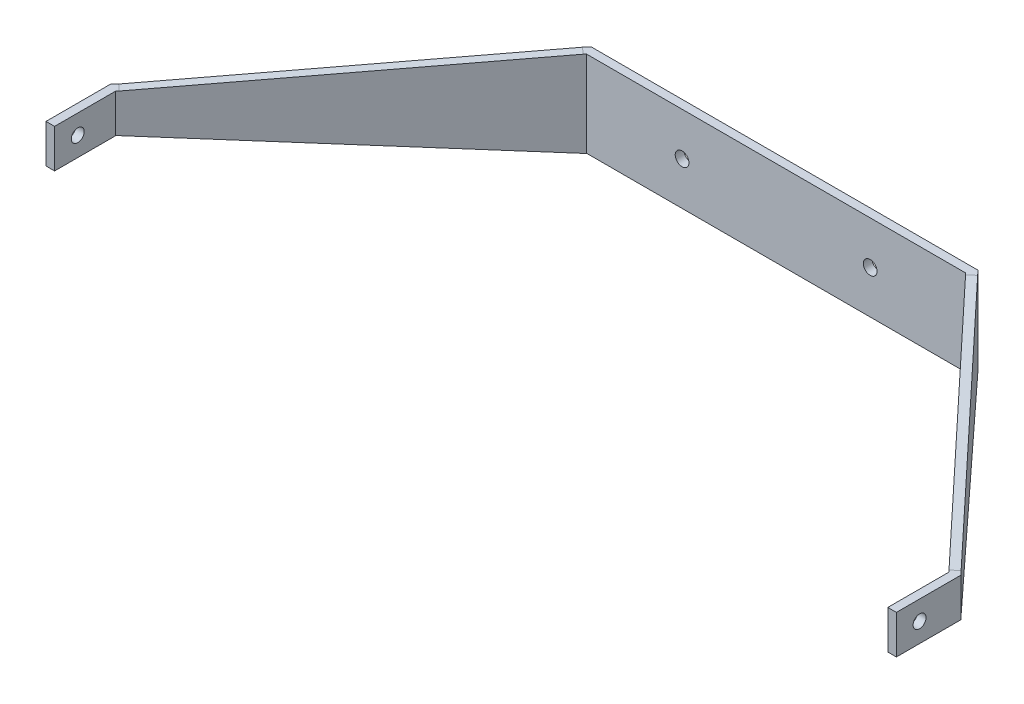
ISO-10303-21;
HEADER;
FILE_DESCRIPTION(('STEP AP214'),'2;1');
FILE_NAME('part.step','',(''),(''),'','','');
FILE_SCHEMA(('AUTOMOTIVE_DESIGN { 1 0 10303 214 1 1 1 1 }'));
ENDSEC;
DATA;
#1=APPLICATION_CONTEXT('core data for automotive mechanical design processes');
#2=APPLICATION_PROTOCOL_DEFINITION('international standard','automotive_design',2000,#1);
#3=PRODUCT_CONTEXT('',#1,'mechanical');
#4=PRODUCT('Part','Part','',(#3));
#5=PRODUCT_RELATED_PRODUCT_CATEGORY('part','',(#4));
#6=PRODUCT_DEFINITION_FORMATION('','',#4);
#7=PRODUCT_DEFINITION_CONTEXT('part definition',#1,'design');
#8=PRODUCT_DEFINITION('design','',#6,#7);
#9=PRODUCT_DEFINITION_SHAPE('','',#8);
#10=(LENGTH_UNIT() NAMED_UNIT(*) SI_UNIT(.MILLI.,.METRE.));
#11=(NAMED_UNIT(*) PLANE_ANGLE_UNIT() SI_UNIT($,.RADIAN.));
#12=(NAMED_UNIT(*) SI_UNIT($,.STERADIAN.) SOLID_ANGLE_UNIT());
#13=UNCERTAINTY_MEASURE_WITH_UNIT(LENGTH_MEASURE(1.E-05),#10,'distance_accuracy_value','');
#14=(GEOMETRIC_REPRESENTATION_CONTEXT(3) GLOBAL_UNCERTAINTY_ASSIGNED_CONTEXT((#13)) GLOBAL_UNIT_ASSIGNED_CONTEXT((#10,
#11,#12)) REPRESENTATION_CONTEXT('',''));
#15=CARTESIAN_POINT('',(0.,0.,0.));
#16=DIRECTION('',(0.,0.,1.));
#17=DIRECTION('',(1.,0.,0.));
#18=AXIS2_PLACEMENT_3D('',#15,#16,#17);
#19=CARTESIAN_POINT('',(122.327482216379,0.,-70.4537234537165));
#20=DIRECTION('',(-0.73189397443135,0.,-0.681418527918843));
#21=DIRECTION('',(0.681418527918843,0.,-0.73189397443135));
#22=AXIS2_PLACEMENT_3D('',#19,#20,#21);
#23=PLANE('',#22);
#24=DIRECTION('',(0.,1.,0.));
#25=VECTOR('',#24,1.);
#26=CARTESIAN_POINT('',(2.,0.,58.786905593505));
#27=LINE('',#26,#25);
#28=CARTESIAN_POINT('',(1.99999999999997,0.,58.786905593505));
#29=VERTEX_POINT('',#28);
#30=CARTESIAN_POINT('',(1.99999999999997,9.,58.786905593505));
#31=VERTEX_POINT('',#30);
#32=EDGE_CURVE('E11',#29,#31,#27,.T.);
#33=ORIENTED_EDGE('',*,*,#32,.F.);
#34=DIRECTION('',(-0.681418527918843,0.,0.73189397443135));
#35=VECTOR('',#34,1.);
#36=CARTESIAN_POINT('',(122.327482216379,0.,-70.4537234537165));
#37=LINE('',#36,#35);
#38=CARTESIAN_POINT('',(2.39245036924484,0.,58.3653848265383));
#39=VERTEX_POINT('',#38);
#40=EDGE_CURVE('E243',#39,#29,#37,.T.);
#41=ORIENTED_EDGE('',*,*,#40,.F.);
#42=DIRECTION('',(-0.679660547415521,0.0717851757294024,0.730005773150003));
#43=VECTOR('',#42,1.);
#44=CARTESIAN_POINT('',(121.709443629971,-12.6021605363077,-69.7899042312789));
#45=LINE('',#44,#43);
#46=CARTESIAN_POINT('',(54.4663357195633,-5.5,2.43417463545552));
#47=VERTEX_POINT('',#46);
#48=EDGE_CURVE('E239',#47,#39,#45,.T.);
#49=ORIENTED_EDGE('',*,*,#48,.F.);
#50=DIRECTION('',(0.681418527918843,0.,-0.73189397443135));
#51=VECTOR('',#50,1.);
#52=CARTESIAN_POINT('',(122.327482216379,-5.5,-70.4537234537165));
#53=LINE('',#52,#51);
#54=CARTESIAN_POINT('',(54.8705672767116,-5.5,2.));
#55=VERTEX_POINT('',#54);
#56=EDGE_CURVE('E235',#47,#55,#53,.T.);
#57=ORIENTED_EDGE('',*,*,#56,.T.);
#58=DIRECTION('',(0.,-1.,0.));
#59=VECTOR('',#58,1.);
#60=CARTESIAN_POINT('',(54.8705672767116,0.,2.));
#61=LINE('',#60,#59);
#62=CARTESIAN_POINT('',(54.8705672767116,14.5,2.));
#63=VERTEX_POINT('',#62);
#64=EDGE_CURVE('E59',#63,#55,#61,.T.);
#65=ORIENTED_EDGE('',*,*,#64,.F.);
#66=DIRECTION('',(0.681418527918843,0.,-0.73189397443135));
#67=VECTOR('',#66,1.);
#68=CARTESIAN_POINT('',(122.327482216379,14.5,-70.4537234537165));
#69=LINE('',#68,#67);
#70=CARTESIAN_POINT('',(54.4663357195633,14.5,2.43417463545552));
#71=VERTEX_POINT('',#70);
#72=EDGE_CURVE('E231',#71,#63,#69,.T.);
#73=ORIENTED_EDGE('',*,*,#72,.F.);
#74=DIRECTION('',(0.679660547415521,0.0717851757294023,-0.730005773150003));
#75=VECTOR('',#74,1.);
#76=CARTESIAN_POINT('',(121.270337663478,21.5557825332172,-69.3182718968974));
#77=LINE('',#76,#75);
#78=CARTESIAN_POINT('',(2.39245036924484,9.,58.3653848265383));
#79=VERTEX_POINT('',#78);
#80=EDGE_CURVE('E226',#79,#71,#77,.T.);
#81=ORIENTED_EDGE('',*,*,#80,.F.);
#82=DIRECTION('',(0.681418527918843,0.,-0.73189397443135));
#83=VECTOR('',#82,1.);
#84=CARTESIAN_POINT('',(122.327482216379,9.,-70.4537234537165));
#85=LINE('',#84,#83);
#86=EDGE_CURVE('E69',#31,#79,#85,.T.);
#87=ORIENTED_EDGE('',*,*,#86,.F.);
#88=EDGE_LOOP('',(#33,#41,#49,#57,#65,#73,#81,#87));
#89=FACE_BOUND('',#88,.T.);
#90=ADVANCED_FACE('F50',(#89),#23,.F.);
#91=CARTESIAN_POINT('',(0.,0.,2.));
#92=DIRECTION('',(0.,0.,1.));
#93=DIRECTION('',(1.,0.,0.));
#94=AXIS2_PLACEMENT_3D('',#91,#92,#93);
#95=PLANE('',#94);
#96=CARTESIAN_POINT('',(120.9,4.5,2.));
#97=DIRECTION('',(0.,0.,1.));
#98=DIRECTION('',(1.,0.,0.));
#99=AXIS2_PLACEMENT_3D('',#96,#97,#98);
#100=CIRCLE('',#99,1.59999999999999);
#101=CARTESIAN_POINT('',(122.5,4.5,2.));
#102=VERTEX_POINT('',#101);
#103=EDGE_CURVE('E712',#102,#102,#100,.T.);
#104=ORIENTED_EDGE('',*,*,#103,.F.);
#105=EDGE_LOOP('',(#104));
#106=FACE_BOUND('',#105,.T.);
#107=CARTESIAN_POINT('',(77.1,4.5,2.));
#108=DIRECTION('',(0.,0.,1.));
#109=DIRECTION('',(1.,0.,0.));
#110=AXIS2_PLACEMENT_3D('',#107,#108,#109);
#111=CIRCLE('',#110,1.60000000000001);
#112=CARTESIAN_POINT('',(78.7,4.5,2.));
#113=VERTEX_POINT('',#112);
#114=EDGE_CURVE('E717',#113,#113,#111,.T.);
#115=ORIENTED_EDGE('',*,*,#114,.F.);
#116=EDGE_LOOP('',(#115));
#117=FACE_BOUND('',#116,.T.);
#118=DIRECTION('',(-1.,0.,0.));
#119=VECTOR('',#118,1.);
#120=CARTESIAN_POINT('',(54.,14.5,2.));
#121=LINE('',#120,#119);
#122=CARTESIAN_POINT('',(143.129432723288,14.5,2.));
#123=VERTEX_POINT('',#122);
#124=EDGE_CURVE('E276',#123,#63,#121,.T.);
#125=ORIENTED_EDGE('',*,*,#124,.T.);
#126=ORIENTED_EDGE('',*,*,#64,.T.);
#127=DIRECTION('',(1.,0.,0.));
#128=VECTOR('',#127,1.);
#129=CARTESIAN_POINT('',(54.,-5.5,2.));
#130=LINE('',#129,#128);
#131=CARTESIAN_POINT('',(143.129432723288,-5.5,2.));
#132=VERTEX_POINT('',#131);
#133=EDGE_CURVE('E279',#55,#132,#130,.T.);
#134=ORIENTED_EDGE('',*,*,#133,.T.);
#135=DIRECTION('',(0.,-1.,0.));
#136=VECTOR('',#135,1.);
#137=CARTESIAN_POINT('',(143.129432723288,0.,2.));
#138=LINE('',#137,#136);
#139=EDGE_CURVE('E394',#123,#132,#138,.T.);
#140=ORIENTED_EDGE('',*,*,#139,.F.);
#141=EDGE_LOOP('',(#125,#126,#134,#140));
#142=FACE_BOUND('',#141,.T.);
#143=ADVANCED_FACE('F404',(#106,#117,#142),#95,.T.);
#144=CARTESIAN_POINT('',(196.,9.,0.));
#145=DIRECTION('',(-1.,0.,0.));
#146=DIRECTION('',(0.,0.,1.));
#147=AXIS2_PLACEMENT_3D('',#144,#145,#146);
#148=PLANE('',#147);
#149=CARTESIAN_POINT('',(196.,4.5,67.6013056648528));
#150=DIRECTION('',(-1.,0.,0.));
#151=DIRECTION('',(0.,0.,1.));
#152=AXIS2_PLACEMENT_3D('',#149,#150,#151);
#153=CIRCLE('',#152,1.5);
#154=CARTESIAN_POINT('',(196.,4.5,69.1013056648528));
#155=VERTEX_POINT('',#154);
#156=EDGE_CURVE('E359',#155,#155,#153,.T.);
#157=ORIENTED_EDGE('',*,*,#156,.F.);
#158=EDGE_LOOP('',(#157));
#159=FACE_BOUND('',#158,.T.);
#160=DIRECTION('',(0.,0.,-1.));
#161=VECTOR('',#160,1.);
#162=CARTESIAN_POINT('',(196.,9.,0.));
#163=LINE('',#162,#161);
#164=CARTESIAN_POINT('',(196.,9.,72.9999999999999));
#165=VERTEX_POINT('',#164);
#166=CARTESIAN_POINT('',(196.,9.,58.786905593505));
#167=VERTEX_POINT('',#166);
#168=EDGE_CURVE('E369',#165,#167,#163,.T.);
#169=ORIENTED_EDGE('',*,*,#168,.T.);
#170=DIRECTION('',(0.,-1.,0.));
#171=VECTOR('',#170,1.);
#172=CARTESIAN_POINT('',(196.,9.,58.786905593505));
#173=LINE('',#172,#171);
#174=CARTESIAN_POINT('',(196.,0.,58.786905593505));
#175=VERTEX_POINT('',#174);
#176=EDGE_CURVE('E343',#167,#175,#173,.T.);
#177=ORIENTED_EDGE('',*,*,#176,.T.);
#178=DIRECTION('',(0.,0.,-1.));
#179=VECTOR('',#178,1.);
#180=CARTESIAN_POINT('',(196.,0.,0.));
#181=LINE('',#180,#179);
#182=CARTESIAN_POINT('',(196.,0.,72.9999999999999));
#183=VERTEX_POINT('',#182);
#184=EDGE_CURVE('E365',#183,#175,#181,.T.);
#185=ORIENTED_EDGE('',*,*,#184,.F.);
#186=DIRECTION('',(0.,-1.,0.));
#187=VECTOR('',#186,1.);
#188=CARTESIAN_POINT('',(196.,9.,72.9999999999999));
#189=LINE('',#188,#187);
#190=EDGE_CURVE('E373',#165,#183,#189,.T.);
#191=ORIENTED_EDGE('',*,*,#190,.F.);
#192=EDGE_LOOP('',(#169,#177,#185,#191));
#193=FACE_BOUND('',#192,.T.);
#194=ADVANCED_FACE('F471',(#159,#193),#148,.T.);
#195=CARTESIAN_POINT('',(0.,9.,72.9999999999999));
#196=DIRECTION('',(0.,0.,1.));
#197=DIRECTION('',(1.,0.,0.));
#198=AXIS2_PLACEMENT_3D('',#195,#196,#197);
#199=PLANE('',#198);
#200=DIRECTION('',(-1.,0.,0.));
#201=VECTOR('',#200,1.);
#202=CARTESIAN_POINT('',(0.,0.,72.9999999999999));
#203=LINE('',#202,#201);
#204=CARTESIAN_POINT('',(198.,0.,72.9999999999999));
#205=VERTEX_POINT('',#204);
#206=EDGE_CURVE('E374',#205,#183,#203,.T.);
#207=ORIENTED_EDGE('',*,*,#206,.F.);
#208=DIRECTION('',(0.,-1.,0.));
#209=VECTOR('',#208,1.);
#210=CARTESIAN_POINT('',(198.,9.,72.9999999999999));
#211=LINE('',#210,#209);
#212=CARTESIAN_POINT('',(198.,9.,72.9999999999999));
#213=VERTEX_POINT('',#212);
#214=EDGE_CURVE('E391',#213,#205,#211,.T.);
#215=ORIENTED_EDGE('',*,*,#214,.F.);
#216=DIRECTION('',(-1.,0.,0.));
#217=VECTOR('',#216,1.);
#218=CARTESIAN_POINT('',(0.,9.,72.9999999999999));
#219=LINE('',#218,#217);
#220=EDGE_CURVE('E360',#213,#165,#219,.T.);
#221=ORIENTED_EDGE('',*,*,#220,.T.);
#222=ORIENTED_EDGE('',*,*,#190,.T.);
#223=EDGE_LOOP('',(#207,#215,#221,#222));
#224=FACE_BOUND('',#223,.T.);
#225=ADVANCED_FACE('F52',(#224),#199,.T.);
#226=CARTESIAN_POINT('',(198.,9.,0.));
#227=DIRECTION('',(-1.,0.,0.));
#228=DIRECTION('',(0.,0.,1.));
#229=AXIS2_PLACEMENT_3D('',#226,#227,#228);
#230=PLANE('',#229);
#231=CARTESIAN_POINT('',(198.,4.5,67.6013056648528));
#232=DIRECTION('',(1.,0.,0.));
#233=DIRECTION('',(0.,0.,-1.));
#234=AXIS2_PLACEMENT_3D('',#231,#232,#233);
#235=CIRCLE('',#234,1.5);
#236=CARTESIAN_POINT('',(198.,4.5,66.1013056648528));
#237=VERTEX_POINT('',#236);
#238=EDGE_CURVE('E355',#237,#237,#235,.T.);
#239=ORIENTED_EDGE('',*,*,#238,.F.);
#240=EDGE_LOOP('',(#239));
#241=FACE_BOUND('',#240,.T.);
#242=DIRECTION('',(0.,0.,-1.));
#243=VECTOR('',#242,1.);
#244=CARTESIAN_POINT('',(198.,0.,0.));
#245=LINE('',#244,#243);
#246=CARTESIAN_POINT('',(198.,0.,58.));
#247=VERTEX_POINT('',#246);
#248=EDGE_CURVE('E378',#205,#247,#245,.T.);
#249=ORIENTED_EDGE('',*,*,#248,.T.);
#250=DIRECTION('',(0.,-1.,0.));
#251=VECTOR('',#250,1.);
#252=CARTESIAN_POINT('',(198.,9.,58.));
#253=LINE('',#252,#251);
#254=CARTESIAN_POINT('',(198.,9.,58.));
#255=VERTEX_POINT('',#254);
#256=EDGE_CURVE('E387',#255,#247,#253,.T.);
#257=ORIENTED_EDGE('',*,*,#256,.F.);
#258=DIRECTION('',(0.,0.,-1.));
#259=VECTOR('',#258,1.);
#260=CARTESIAN_POINT('',(198.,9.,0.));
#261=LINE('',#260,#259);
#262=EDGE_CURVE('E364',#213,#255,#261,.T.);
#263=ORIENTED_EDGE('',*,*,#262,.F.);
#264=ORIENTED_EDGE('',*,*,#214,.T.);
#265=EDGE_LOOP('',(#249,#257,#263,#264));
#266=FACE_BOUND('',#265,.T.);
#267=ADVANCED_FACE('F509',(#241,#266),#230,.F.);
#268=CARTESIAN_POINT('',(0.,9.,0.));
#269=DIRECTION('',(0.,1.,0.));
#270=DIRECTION('',(0.,0.,1.));
#271=AXIS2_PLACEMENT_3D('',#268,#269,#270);
#272=PLANE('',#271);
#273=ORIENTED_EDGE('',*,*,#262,.T.);
#274=DIRECTION('',(-0.681418527918843,0.,-0.73189397443135));
#275=VECTOR('',#274,1.);
#276=CARTESIAN_POINT('',(77.136305732484,9.,-71.8165605095542));
#277=LINE('',#276,#275);
#278=CARTESIAN_POINT('',(197.071337579618,9.,57.0025477707006));
#279=VERTEX_POINT('',#278);
#280=EDGE_CURVE('E283',#255,#279,#277,.T.);
#281=ORIENTED_EDGE('',*,*,#280,.T.);
#282=DIRECTION('',(0.731893974431349,0.,-0.681418527918843));
#283=VECTOR('',#282,1.);
#284=CARTESIAN_POINT('',(195.607549630755,9.,58.3653848265383));
#285=LINE('',#284,#283);
#286=CARTESIAN_POINT('',(195.607549630755,9.,58.3653848265383));
#287=VERTEX_POINT('',#286);
#288=EDGE_CURVE('E340',#287,#279,#285,.T.);
#289=ORIENTED_EDGE('',*,*,#288,.F.);
#290=DIRECTION('',(-0.681418527918843,0.,-0.73189397443135));
#291=VECTOR('',#290,1.);
#292=CARTESIAN_POINT('',(75.6725177836213,9.,-70.4537234537165));
#293=LINE('',#292,#291);
#294=EDGE_CURVE('E292',#167,#287,#293,.T.);
#295=ORIENTED_EDGE('',*,*,#294,.F.);
#296=ORIENTED_EDGE('',*,*,#168,.F.);
#297=ORIENTED_EDGE('',*,*,#220,.F.);
#298=EDGE_LOOP('',(#273,#281,#289,#295,#296,#297));
#299=FACE_BOUND('',#298,.T.);
#300=ADVANCED_FACE('F506',(#299),#272,.T.);
#301=CARTESIAN_POINT('',(0.,0.,0.));
#302=DIRECTION('',(0.,1.,0.));
#303=DIRECTION('',(0.,0.,1.));
#304=AXIS2_PLACEMENT_3D('',#301,#302,#303);
#305=PLANE('',#304);
#306=DIRECTION('',(0.681418527918843,0.,0.73189397443135));
#307=VECTOR('',#306,1.);
#308=CARTESIAN_POINT('',(75.6725177836213,0.,-70.4537234537165));
#309=LINE('',#308,#307);
#310=CARTESIAN_POINT('',(195.607549630755,0.,58.3653848265383));
#311=VERTEX_POINT('',#310);
#312=EDGE_CURVE('E295',#311,#175,#309,.T.);
#313=ORIENTED_EDGE('',*,*,#312,.F.);
#314=DIRECTION('',(0.731893974431349,0.,-0.681418527918843));
#315=VECTOR('',#314,1.);
#316=CARTESIAN_POINT('',(195.607549630755,0.,58.3653848265383));
#317=LINE('',#316,#315);
#318=CARTESIAN_POINT('',(197.071337579618,0.,57.0025477707006));
#319=VERTEX_POINT('',#318);
#320=EDGE_CURVE('E314',#311,#319,#317,.T.);
#321=ORIENTED_EDGE('',*,*,#320,.T.);
#322=DIRECTION('',(0.681418527918843,0.,0.73189397443135));
#323=VECTOR('',#322,1.);
#324=CARTESIAN_POINT('',(77.136305732484,0.,-71.8165605095542));
#325=LINE('',#324,#323);
#326=EDGE_CURVE('E318',#319,#247,#325,.T.);
#327=ORIENTED_EDGE('',*,*,#326,.T.);
#328=ORIENTED_EDGE('',*,*,#248,.F.);
#329=ORIENTED_EDGE('',*,*,#206,.T.);
#330=ORIENTED_EDGE('',*,*,#184,.T.);
#331=EDGE_LOOP('',(#313,#321,#327,#328,#329,#330));
#332=FACE_BOUND('',#331,.T.);
#333=ADVANCED_FACE('F504',(#332),#305,.F.);
#334=CARTESIAN_POINT('',(0.,4.5,67.6013056648528));
#335=DIRECTION('',(1.,0.,0.));
#336=DIRECTION('',(0.,0.,-1.));
#337=AXIS2_PLACEMENT_3D('',#334,#335,#336);
#338=CYLINDRICAL_SURFACE('',#337,1.5);
#339=ORIENTED_EDGE('',*,*,#156,.T.);
#340=EDGE_LOOP('',(#339));
#341=FACE_BOUND('',#340,.T.);
#342=ORIENTED_EDGE('',*,*,#238,.T.);
#343=EDGE_LOOP('',(#342));
#344=FACE_BOUND('',#343,.T.);
#345=ADVANCED_FACE('F494',(#341,#344),#338,.F.);
#346=CARTESIAN_POINT('',(76.7296623365218,21.5557825332172,-69.3182718968974));
#347=DIRECTION('',(-0.0489157487719248,-0.997420116372985,-0.0525391375698451));
#348=DIRECTION('',(0.,0.0526021071184824,-0.998615550813573));
#349=AXIS2_PLACEMENT_3D('',#346,#347,#348);
#350=PLANE('',#349);
#351=DIRECTION('',(-0.679660547415521,0.0717851757294023,-0.730005773150003));
#352=VECTOR('',#351,1.);
#353=CARTESIAN_POINT('',(78.1934502853845,21.5557825332172,-70.6811089527351));
#354=LINE('',#353,#352);
#355=CARTESIAN_POINT('',(144.997452229299,14.5,1.07133757961783));
#356=VERTEX_POINT('',#355);
#357=EDGE_CURVE('E296',#279,#356,#354,.T.);
#358=ORIENTED_EDGE('',*,*,#357,.T.);
#359=DIRECTION('',(0.731893974431349,0.,-0.681418527918843));
#360=VECTOR('',#359,1.);
#361=CARTESIAN_POINT('',(143.533664280437,14.5,2.43417463545552));
#362=LINE('',#361,#360);
#363=CARTESIAN_POINT('',(143.533664280437,14.5,2.43417463545552));
#364=VERTEX_POINT('',#363);
#365=EDGE_CURVE('E344',#364,#356,#362,.T.);
#366=ORIENTED_EDGE('',*,*,#365,.F.);
#367=DIRECTION('',(-0.679660547415521,0.0717851757294023,-0.730005773150003));
#368=VECTOR('',#367,1.);
#369=CARTESIAN_POINT('',(76.7296623365218,21.5557825332172,-69.3182718968974));
#370=LINE('',#369,#368);
#371=EDGE_CURVE('E311',#287,#364,#370,.T.);
#372=ORIENTED_EDGE('',*,*,#371,.F.);
#373=ORIENTED_EDGE('',*,*,#288,.T.);
#374=EDGE_LOOP('',(#358,#366,#372,#373));
#375=FACE_BOUND('',#374,.T.);
#376=ADVANCED_FACE('F491',(#375),#350,.F.);
#377=CARTESIAN_POINT('',(75.6725177836213,14.5,-70.4537234537165));
#378=DIRECTION('',(0.,-1.,0.));
#379=DIRECTION('',(0.,0.,-1.));
#380=AXIS2_PLACEMENT_3D('',#377,#378,#379);
#381=PLANE('',#380);
#382=DIRECTION('',(-1.,0.,0.));
#383=VECTOR('',#382,1.);
#384=CARTESIAN_POINT('',(54.,14.5,0.));
#385=LINE('',#384,#383);
#386=CARTESIAN_POINT('',(144.,14.5,0.));
#387=VERTEX_POINT('',#386);
#388=CARTESIAN_POINT('',(54.,14.5,0.));
#389=VERTEX_POINT('',#388);
#390=EDGE_CURVE('E267',#387,#389,#385,.T.);
#391=ORIENTED_EDGE('',*,*,#390,.T.);
#392=DIRECTION('',(0.681418527918843,0.,-0.73189397443135));
#393=VECTOR('',#392,1.);
#394=CARTESIAN_POINT('',(120.863694267516,14.5,-71.8165605095542));
#395=LINE('',#394,#393);
#396=CARTESIAN_POINT('',(53.0025477707006,14.5,1.07133757961783));
#397=VERTEX_POINT('',#396);
#398=EDGE_CURVE('E250',#397,#389,#395,.T.);
#399=ORIENTED_EDGE('',*,*,#398,.F.);
#400=DIRECTION('',(-0.731893974431349,0.,-0.681418527918843));
#401=VECTOR('',#400,1.);
#402=CARTESIAN_POINT('',(54.4663357195633,14.5,2.43417463545552));
#403=LINE('',#402,#401);
#404=EDGE_CURVE('E271',#71,#397,#403,.T.);
#405=ORIENTED_EDGE('',*,*,#404,.F.);
#406=ORIENTED_EDGE('',*,*,#72,.T.);
#407=ORIENTED_EDGE('',*,*,#124,.F.);
#408=DIRECTION('',(-0.681418527918843,0.,-0.73189397443135));
#409=VECTOR('',#408,1.);
#410=CARTESIAN_POINT('',(75.6725177836213,14.5,-70.4537234537165));
#411=LINE('',#410,#409);
#412=EDGE_CURVE('E307',#364,#123,#411,.T.);
#413=ORIENTED_EDGE('',*,*,#412,.F.);
#414=ORIENTED_EDGE('',*,*,#365,.T.);
#415=DIRECTION('',(-0.681418527918843,0.,-0.73189397443135));
#416=VECTOR('',#415,1.);
#417=CARTESIAN_POINT('',(77.136305732484,14.5,-71.8165605095542));
#418=LINE('',#417,#416);
#419=EDGE_CURVE('E333',#356,#387,#418,.T.);
#420=ORIENTED_EDGE('',*,*,#419,.T.);
#421=EDGE_LOOP('',(#391,#399,#405,#406,#407,#413,#414,#420));
#422=FACE_BOUND('',#421,.T.);
#423=ADVANCED_FACE('F438',(#422),#381,.F.);
#424=CARTESIAN_POINT('',(75.6725177836213,-5.5,-70.4537234537165));
#425=DIRECTION('',(0.,-1.,0.));
#426=DIRECTION('',(0.,0.,-1.));
#427=AXIS2_PLACEMENT_3D('',#424,#425,#426);
#428=PLANE('',#427);
#429=DIRECTION('',(0.681418527918843,0.,-0.73189397443135));
#430=VECTOR('',#429,1.);
#431=CARTESIAN_POINT('',(120.863694267516,-5.5,-71.8165605095542));
#432=LINE('',#431,#430);
#433=CARTESIAN_POINT('',(53.0025477707006,-5.5,1.07133757961783));
#434=VERTEX_POINT('',#433);
#435=CARTESIAN_POINT('',(54.,-5.5,0.));
#436=VERTEX_POINT('',#435);
#437=EDGE_CURVE('E254',#434,#436,#432,.T.);
#438=ORIENTED_EDGE('',*,*,#437,.T.);
#439=DIRECTION('',(1.,0.,0.));
#440=VECTOR('',#439,1.);
#441=CARTESIAN_POINT('',(54.,-5.5,0.));
#442=LINE('',#441,#440);
#443=CARTESIAN_POINT('',(144.,-5.5,0.));
#444=VERTEX_POINT('',#443);
#445=EDGE_CURVE('E280',#436,#444,#442,.T.);
#446=ORIENTED_EDGE('',*,*,#445,.T.);
#447=DIRECTION('',(-0.681418527918843,0.,-0.73189397443135));
#448=VECTOR('',#447,1.);
#449=CARTESIAN_POINT('',(77.136305732484,-5.5,-71.8165605095542));
#450=LINE('',#449,#448);
#451=CARTESIAN_POINT('',(144.997452229299,-5.5,1.07133757961783));
#452=VERTEX_POINT('',#451);
#453=EDGE_CURVE('E325',#452,#444,#450,.T.);
#454=ORIENTED_EDGE('',*,*,#453,.F.);
#455=DIRECTION('',(0.731893974431349,0.,-0.681418527918843));
#456=VECTOR('',#455,1.);
#457=CARTESIAN_POINT('',(143.533664280437,-5.5,2.43417463545552));
#458=LINE('',#457,#456);
#459=CARTESIAN_POINT('',(143.533664280437,-5.5,2.43417463545552));
#460=VERTEX_POINT('',#459);
#461=EDGE_CURVE('E347',#460,#452,#458,.T.);
#462=ORIENTED_EDGE('',*,*,#461,.F.);
#463=DIRECTION('',(-0.681418527918843,0.,-0.73189397443135));
#464=VECTOR('',#463,1.);
#465=CARTESIAN_POINT('',(75.6725177836213,-5.5,-70.4537234537165));
#466=LINE('',#465,#464);
#467=EDGE_CURVE('E303',#460,#132,#466,.T.);
#468=ORIENTED_EDGE('',*,*,#467,.T.);
#469=ORIENTED_EDGE('',*,*,#133,.F.);
#470=ORIENTED_EDGE('',*,*,#56,.F.);
#471=DIRECTION('',(-0.731893974431349,0.,-0.681418527918843));
#472=VECTOR('',#471,1.);
#473=CARTESIAN_POINT('',(54.4663357195633,-5.5,2.43417463545552));
#474=LINE('',#473,#472);
#475=EDGE_CURVE('E268',#47,#434,#474,.T.);
#476=ORIENTED_EDGE('',*,*,#475,.T.);
#477=EDGE_LOOP('',(#438,#446,#454,#462,#468,#469,#470,#476));
#478=FACE_BOUND('',#477,.T.);
#479=ADVANCED_FACE('F409',(#478),#428,.T.);
#480=CARTESIAN_POINT('',(76.2905563700287,-12.6021605363077,-69.7899042312789));
#481=DIRECTION('',(-0.0489157487719248,0.997420116372985,-0.0525391375698451));
#482=DIRECTION('',(0.,0.0526021071184824,0.998615550813573));
#483=AXIS2_PLACEMENT_3D('',#480,#481,#482);
#484=PLANE('',#483);
#485=DIRECTION('',(0.679660547415521,0.0717851757294024,0.730005773150003));
#486=VECTOR('',#485,1.);
#487=CARTESIAN_POINT('',(77.7543443188914,-12.6021605363077,-71.1527412871165));
#488=LINE('',#487,#486);
#489=EDGE_CURVE('E321',#452,#319,#488,.T.);
#490=ORIENTED_EDGE('',*,*,#489,.T.);
#491=ORIENTED_EDGE('',*,*,#320,.F.);
#492=DIRECTION('',(0.679660547415521,0.0717851757294024,0.730005773150003));
#493=VECTOR('',#492,1.);
#494=CARTESIAN_POINT('',(76.2905563700287,-12.6021605363077,-69.7899042312789));
#495=LINE('',#494,#493);
#496=EDGE_CURVE('E299',#460,#311,#495,.T.);
#497=ORIENTED_EDGE('',*,*,#496,.F.);
#498=ORIENTED_EDGE('',*,*,#461,.T.);
#499=EDGE_LOOP('',(#490,#491,#497,#498));
#500=FACE_BOUND('',#499,.T.);
#501=ADVANCED_FACE('F432',(#500),#484,.F.);
#502=CARTESIAN_POINT('',(75.6725177836213,0.,-70.4537234537165));
#503=DIRECTION('',(0.73189397443135,0.,-0.681418527918843));
#504=DIRECTION('',(-0.681418527918843,0.,-0.73189397443135));
#505=AXIS2_PLACEMENT_3D('',#502,#503,#504);
#506=PLANE('',#505);
#507=ORIENTED_EDGE('',*,*,#412,.T.);
#508=ORIENTED_EDGE('',*,*,#139,.T.);
#509=ORIENTED_EDGE('',*,*,#467,.F.);
#510=ORIENTED_EDGE('',*,*,#496,.T.);
#511=ORIENTED_EDGE('',*,*,#312,.T.);
#512=ORIENTED_EDGE('',*,*,#176,.F.);
#513=ORIENTED_EDGE('',*,*,#294,.T.);
#514=ORIENTED_EDGE('',*,*,#371,.T.);
#515=EDGE_LOOP('',(#507,#508,#509,#510,#511,#512,#513,#514));
#516=FACE_BOUND('',#515,.T.);
#517=ADVANCED_FACE('F435',(#516),#506,.F.);
#518=CARTESIAN_POINT('',(77.136305732484,0.,-71.8165605095542));
#519=DIRECTION('',(0.73189397443135,0.,-0.681418527918843));
#520=DIRECTION('',(-0.681418527918843,0.,-0.73189397443135));
#521=AXIS2_PLACEMENT_3D('',#518,#519,#520);
#522=PLANE('',#521);
#523=ORIENTED_EDGE('',*,*,#280,.F.);
#524=ORIENTED_EDGE('',*,*,#256,.T.);
#525=ORIENTED_EDGE('',*,*,#326,.F.);
#526=ORIENTED_EDGE('',*,*,#489,.F.);
#527=ORIENTED_EDGE('',*,*,#453,.T.);
#528=DIRECTION('',(0.,1.,0.));
#529=VECTOR('',#528,1.);
#530=CARTESIAN_POINT('',(144.,0.,0.));
#531=LINE('',#530,#529);
#532=EDGE_CURVE('E329',#444,#387,#531,.T.);
#533=ORIENTED_EDGE('',*,*,#532,.T.);
#534=ORIENTED_EDGE('',*,*,#419,.F.);
#535=ORIENTED_EDGE('',*,*,#357,.F.);
#536=EDGE_LOOP('',(#523,#524,#525,#526,#527,#533,#534,#535));
#537=FACE_BOUND('',#536,.T.);
#538=ADVANCED_FACE('F428',(#537),#522,.T.);
#539=CARTESIAN_POINT('',(0.,0.,0.));
#540=DIRECTION('',(0.,0.,1.));
#541=DIRECTION('',(1.,0.,0.));
#542=AXIS2_PLACEMENT_3D('',#539,#540,#541);
#543=PLANE('',#542);
#544=CARTESIAN_POINT('',(120.9,4.5,0.));
#545=DIRECTION('',(0.,0.,-1.));
#546=DIRECTION('',(-1.,0.,0.));
#547=AXIS2_PLACEMENT_3D('',#544,#545,#546);
#548=CIRCLE('',#547,1.59999999999999);
#549=CARTESIAN_POINT('',(119.3,4.5,0.));
#550=VERTEX_POINT('',#549);
#551=EDGE_CURVE('E715',#550,#550,#548,.T.);
#552=ORIENTED_EDGE('',*,*,#551,.F.);
#553=EDGE_LOOP('',(#552));
#554=FACE_BOUND('',#553,.T.);
#555=CARTESIAN_POINT('',(77.1,4.5,0.));
#556=DIRECTION('',(0.,0.,-1.));
#557=DIRECTION('',(-1.,0.,0.));
#558=AXIS2_PLACEMENT_3D('',#555,#556,#557);
#559=CIRCLE('',#558,1.60000000000001);
#560=CARTESIAN_POINT('',(75.5,4.5,0.));
#561=VERTEX_POINT('',#560);
#562=EDGE_CURVE('E718',#561,#561,#559,.T.);
#563=ORIENTED_EDGE('',*,*,#562,.F.);
#564=EDGE_LOOP('',(#563));
#565=FACE_BOUND('',#564,.T.);
#566=ORIENTED_EDGE('',*,*,#532,.F.);
#567=ORIENTED_EDGE('',*,*,#445,.F.);
#568=DIRECTION('',(0.,-1.,0.));
#569=VECTOR('',#568,1.);
#570=CARTESIAN_POINT('',(54.,14.5,0.));
#571=LINE('',#570,#569);
#572=EDGE_CURVE('E286',#389,#436,#571,.T.);
#573=ORIENTED_EDGE('',*,*,#572,.F.);
#574=ORIENTED_EDGE('',*,*,#390,.F.);
#575=EDGE_LOOP('',(#566,#567,#573,#574));
#576=FACE_BOUND('',#575,.T.);
#577=ADVANCED_FACE('F423',(#554,#565,#576),#543,.F.);
#578=CARTESIAN_POINT('',(122.327482216379,9.,-70.4537234537165));
#579=DIRECTION('',(0.,1.,0.));
#580=DIRECTION('',(0.,0.,1.));
#581=AXIS2_PLACEMENT_3D('',#578,#579,#580);
#582=PLANE('',#581);
#583=DIRECTION('',(0.681418527918843,0.,-0.73189397443135));
#584=VECTOR('',#583,1.);
#585=CARTESIAN_POINT('',(120.863694267516,9.,-71.8165605095542));
#586=LINE('',#585,#584);
#587=CARTESIAN_POINT('',(0.,9.,58.));
#588=VERTEX_POINT('',#587);
#589=CARTESIAN_POINT('',(0.928662420382143,9.,57.0025477707006));
#590=VERTEX_POINT('',#589);
#591=EDGE_CURVE('E211',#588,#590,#586,.T.);
#592=ORIENTED_EDGE('',*,*,#591,.F.);
#593=DIRECTION('',(0.,0.,1.));
#594=VECTOR('',#593,1.);
#595=CARTESIAN_POINT('',(0.,9.,0.));
#596=LINE('',#595,#594);
#597=CARTESIAN_POINT('',(0.,9.,73.));
#598=VERTEX_POINT('',#597);
#599=EDGE_CURVE('E194',#588,#598,#596,.T.);
#600=ORIENTED_EDGE('',*,*,#599,.T.);
#601=DIRECTION('',(1.,0.,0.));
#602=VECTOR('',#601,1.);
#603=CARTESIAN_POINT('',(0.,9.,73.));
#604=LINE('',#603,#602);
#605=CARTESIAN_POINT('',(2.,9.,73.));
#606=VERTEX_POINT('',#605);
#607=EDGE_CURVE('E195',#598,#606,#604,.T.);
#608=ORIENTED_EDGE('',*,*,#607,.T.);
#609=DIRECTION('',(0.,0.,-1.));
#610=VECTOR('',#609,1.);
#611=CARTESIAN_POINT('',(2.,9.,0.));
#612=LINE('',#611,#610);
#613=EDGE_CURVE('E185',#606,#31,#612,.T.);
#614=ORIENTED_EDGE('',*,*,#613,.T.);
#615=ORIENTED_EDGE('',*,*,#86,.T.);
#616=DIRECTION('',(-0.731893974431349,0.,-0.681418527918843));
#617=VECTOR('',#616,1.);
#618=CARTESIAN_POINT('',(2.39245036924484,9.,58.3653848265383));
#619=LINE('',#618,#617);
#620=EDGE_CURVE('E245',#79,#590,#619,.T.);
#621=ORIENTED_EDGE('',*,*,#620,.T.);
#622=EDGE_LOOP('',(#592,#600,#608,#614,#615,#621));
#623=FACE_BOUND('',#622,.T.);
#624=ADVANCED_FACE('F199',(#623),#582,.T.);
#625=CARTESIAN_POINT('',(122.327482216379,0.,-70.4537234537165));
#626=DIRECTION('',(0.,-1.,0.));
#627=DIRECTION('',(0.,0.,-1.));
#628=AXIS2_PLACEMENT_3D('',#625,#626,#627);
#629=PLANE('',#628);
#630=DIRECTION('',(-0.681418527918843,0.,0.73189397443135));
#631=VECTOR('',#630,1.);
#632=CARTESIAN_POINT('',(120.863694267516,0.,-71.8165605095542));
#633=LINE('',#632,#631);
#634=CARTESIAN_POINT('',(0.928662420382143,0.,57.0025477707006));
#635=VERTEX_POINT('',#634);
#636=CARTESIAN_POINT('',(0.,0.,58.));
#637=VERTEX_POINT('',#636);
#638=EDGE_CURVE('E227',#635,#637,#633,.T.);
#639=ORIENTED_EDGE('',*,*,#638,.F.);
#640=DIRECTION('',(-0.731893974431349,0.,-0.681418527918843));
#641=VECTOR('',#640,1.);
#642=CARTESIAN_POINT('',(2.39245036924484,0.,58.3653848265383));
#643=LINE('',#642,#641);
#644=EDGE_CURVE('E264',#39,#635,#643,.T.);
#645=ORIENTED_EDGE('',*,*,#644,.F.);
#646=ORIENTED_EDGE('',*,*,#40,.T.);
#647=DIRECTION('',(0.,0.,-1.));
#648=VECTOR('',#647,1.);
#649=CARTESIAN_POINT('',(2.,0.,0.));
#650=LINE('',#649,#648);
#651=CARTESIAN_POINT('',(2.,0.,73.));
#652=VERTEX_POINT('',#651);
#653=EDGE_CURVE('E452',#652,#29,#650,.T.);
#654=ORIENTED_EDGE('',*,*,#653,.F.);
#655=DIRECTION('',(1.,0.,0.));
#656=VECTOR('',#655,1.);
#657=CARTESIAN_POINT('',(0.,0.,73.));
#658=LINE('',#657,#656);
#659=CARTESIAN_POINT('',(0.,0.,73.));
#660=VERTEX_POINT('',#659);
#661=EDGE_CURVE('E209',#660,#652,#658,.T.);
#662=ORIENTED_EDGE('',*,*,#661,.F.);
#663=DIRECTION('',(0.,0.,1.));
#664=VECTOR('',#663,1.);
#665=CARTESIAN_POINT('',(0.,0.,0.));
#666=LINE('',#665,#664);
#667=EDGE_CURVE('E205',#637,#660,#666,.T.);
#668=ORIENTED_EDGE('',*,*,#667,.F.);
#669=EDGE_LOOP('',(#639,#645,#646,#654,#662,#668));
#670=FACE_BOUND('',#669,.T.);
#671=ADVANCED_FACE('F458',(#670),#629,.T.);
#672=CARTESIAN_POINT('',(121.709443629971,-12.6021605363077,-69.7899042312789));
#673=DIRECTION('',(-0.0489157487719248,-0.997420116372985,0.0525391375698451));
#674=DIRECTION('',(0.,-0.0526021071184824,-0.998615550813573));
#675=AXIS2_PLACEMENT_3D('',#672,#673,#674);
#676=PLANE('',#675);
#677=DIRECTION('',(-0.679660547415521,0.0717851757294024,0.730005773150003));
#678=VECTOR('',#677,1.);
#679=CARTESIAN_POINT('',(120.245655681109,-12.6021605363077,-71.1527412871165));
#680=LINE('',#679,#678);
#681=EDGE_CURVE('E258',#434,#635,#680,.T.);
#682=ORIENTED_EDGE('',*,*,#681,.F.);
#683=ORIENTED_EDGE('',*,*,#475,.F.);
#684=ORIENTED_EDGE('',*,*,#48,.T.);
#685=ORIENTED_EDGE('',*,*,#644,.T.);
#686=EDGE_LOOP('',(#682,#683,#684,#685));
#687=FACE_BOUND('',#686,.T.);
#688=ADVANCED_FACE('F414',(#687),#676,.T.);
#689=CARTESIAN_POINT('',(121.270337663478,21.5557825332172,-69.3182718968974));
#690=DIRECTION('',(-0.0489157487719248,0.997420116372985,0.0525391375698451));
#691=DIRECTION('',(0.,-0.0526021071184824,0.998615550813573));
#692=AXIS2_PLACEMENT_3D('',#689,#690,#691);
#693=PLANE('',#692);
#694=DIRECTION('',(0.679660547415521,0.0717851757294023,-0.730005773150003));
#695=VECTOR('',#694,1.);
#696=CARTESIAN_POINT('',(119.806549714615,21.5557825332172,-70.6811089527351));
#697=LINE('',#696,#695);
#698=EDGE_CURVE('E217',#590,#397,#697,.T.);
#699=ORIENTED_EDGE('',*,*,#698,.F.);
#700=ORIENTED_EDGE('',*,*,#620,.F.);
#701=ORIENTED_EDGE('',*,*,#80,.T.);
#702=ORIENTED_EDGE('',*,*,#404,.T.);
#703=EDGE_LOOP('',(#699,#700,#701,#702));
#704=FACE_BOUND('',#703,.T.);
#705=ADVANCED_FACE('F442',(#704),#693,.T.);
#706=CARTESIAN_POINT('',(120.863694267516,0.,-71.8165605095542));
#707=DIRECTION('',(-0.73189397443135,0.,-0.681418527918843));
#708=DIRECTION('',(0.681418527918843,0.,-0.73189397443135));
#709=AXIS2_PLACEMENT_3D('',#706,#707,#708);
#710=PLANE('',#709);
#711=ORIENTED_EDGE('',*,*,#591,.T.);
#712=ORIENTED_EDGE('',*,*,#698,.T.);
#713=ORIENTED_EDGE('',*,*,#398,.T.);
#714=ORIENTED_EDGE('',*,*,#572,.T.);
#715=ORIENTED_EDGE('',*,*,#437,.F.);
#716=ORIENTED_EDGE('',*,*,#681,.T.);
#717=ORIENTED_EDGE('',*,*,#638,.T.);
#718=DIRECTION('',(0.,-1.,0.));
#719=VECTOR('',#718,1.);
#720=CARTESIAN_POINT('',(0.,9.,58.));
#721=LINE('',#720,#719);
#722=EDGE_CURVE('E212',#588,#637,#721,.T.);
#723=ORIENTED_EDGE('',*,*,#722,.F.);
#724=EDGE_LOOP('',(#711,#712,#713,#714,#715,#716,#717,#723));
#725=FACE_BOUND('',#724,.T.);
#726=ADVANCED_FACE('F418',(#725),#710,.T.);
#727=CARTESIAN_POINT('',(2.,9.,0.));
#728=DIRECTION('',(-1.,0.,0.));
#729=DIRECTION('',(0.,0.,1.));
#730=AXIS2_PLACEMENT_3D('',#727,#728,#729);
#731=PLANE('',#730);
#732=CARTESIAN_POINT('',(2.,4.5,67.6013056648528));
#733=DIRECTION('',(-1.,0.,0.));
#734=DIRECTION('',(0.,0.,1.));
#735=AXIS2_PLACEMENT_3D('',#732,#733,#734);
#736=CIRCLE('',#735,1.5);
#737=CARTESIAN_POINT('',(2.,4.5,69.1013056648528));
#738=VERTEX_POINT('',#737);
#739=EDGE_CURVE('E453',#738,#738,#736,.T.);
#740=ORIENTED_EDGE('',*,*,#739,.T.);
#741=EDGE_LOOP('',(#740));
#742=FACE_BOUND('',#741,.T.);
#743=ORIENTED_EDGE('',*,*,#653,.T.);
#744=ORIENTED_EDGE('',*,*,#32,.T.);
#745=ORIENTED_EDGE('',*,*,#613,.F.);
#746=DIRECTION('',(0.,-1.,0.));
#747=VECTOR('',#746,1.);
#748=CARTESIAN_POINT('',(2.,9.,73.));
#749=LINE('',#748,#747);
#750=EDGE_CURVE('E190',#606,#652,#749,.T.);
#751=ORIENTED_EDGE('',*,*,#750,.T.);
#752=EDGE_LOOP('',(#743,#744,#745,#751));
#753=FACE_BOUND('',#752,.T.);
#754=ADVANCED_FACE('F188',(#742,#753),#731,.F.);
#755=CARTESIAN_POINT('',(0.,9.,73.));
#756=DIRECTION('',(0.,0.,-1.));
#757=DIRECTION('',(-1.,0.,0.));
#758=AXIS2_PLACEMENT_3D('',#755,#756,#757);
#759=PLANE('',#758);
#760=ORIENTED_EDGE('',*,*,#661,.T.);
#761=ORIENTED_EDGE('',*,*,#750,.F.);
#762=ORIENTED_EDGE('',*,*,#607,.F.);
#763=DIRECTION('',(0.,-1.,0.));
#764=VECTOR('',#763,1.);
#765=CARTESIAN_POINT('',(0.,9.,73.));
#766=LINE('',#765,#764);
#767=EDGE_CURVE('E220',#598,#660,#766,.T.);
#768=ORIENTED_EDGE('',*,*,#767,.T.);
#769=EDGE_LOOP('',(#760,#761,#762,#768));
#770=FACE_BOUND('',#769,.T.);
#771=ADVANCED_FACE('F207',(#770),#759,.F.);
#772=CARTESIAN_POINT('',(0.,9.,0.));
#773=DIRECTION('',(1.,0.,0.));
#774=DIRECTION('',(0.,0.,-1.));
#775=AXIS2_PLACEMENT_3D('',#772,#773,#774);
#776=PLANE('',#775);
#777=CARTESIAN_POINT('',(0.,4.5,67.6013056648528));
#778=DIRECTION('',(1.,0.,0.));
#779=DIRECTION('',(0.,0.,-1.));
#780=AXIS2_PLACEMENT_3D('',#777,#778,#779);
#781=CIRCLE('',#780,1.5);
#782=CARTESIAN_POINT('',(0.,4.5,66.1013056648528));
#783=VERTEX_POINT('',#782);
#784=EDGE_CURVE('E729',#783,#783,#781,.T.);
#785=ORIENTED_EDGE('',*,*,#784,.T.);
#786=EDGE_LOOP('',(#785));
#787=FACE_BOUND('',#786,.T.);
#788=ORIENTED_EDGE('',*,*,#667,.T.);
#789=ORIENTED_EDGE('',*,*,#767,.F.);
#790=ORIENTED_EDGE('',*,*,#599,.F.);
#791=ORIENTED_EDGE('',*,*,#722,.T.);
#792=EDGE_LOOP('',(#788,#789,#790,#791));
#793=FACE_BOUND('',#792,.T.);
#794=ADVANCED_FACE('F444',(#787,#793),#776,.F.);
#795=CARTESIAN_POINT('',(0.,4.5,67.6013056648528));
#796=DIRECTION('',(1.,0.,0.));
#797=DIRECTION('',(0.,0.,-1.));
#798=AXIS2_PLACEMENT_3D('',#795,#796,#797);
#799=CYLINDRICAL_SURFACE('',#798,1.5);
#800=ORIENTED_EDGE('',*,*,#784,.F.);
#801=EDGE_LOOP('',(#800));
#802=FACE_BOUND('',#801,.T.);
#803=ORIENTED_EDGE('',*,*,#739,.F.);
#804=EDGE_LOOP('',(#803));
#805=FACE_BOUND('',#804,.T.);
#806=ADVANCED_FACE('F673',(#802,#805),#799,.F.);
#807=CARTESIAN_POINT('',(77.1,4.5,10.));
#808=DIRECTION('',(0.,0.,-1.));
#809=DIRECTION('',(-1.,0.,0.));
#810=AXIS2_PLACEMENT_3D('',#807,#808,#809);
#811=CYLINDRICAL_SURFACE('',#810,1.60000000000001);
#812=ORIENTED_EDGE('',*,*,#114,.T.);
#813=EDGE_LOOP('',(#812));
#814=FACE_BOUND('',#813,.T.);
#815=ORIENTED_EDGE('',*,*,#562,.T.);
#816=EDGE_LOOP('',(#815));
#817=FACE_BOUND('',#816,.T.);
#818=ADVANCED_FACE('F684',(#814,#817),#811,.F.);
#819=CARTESIAN_POINT('',(120.9,4.5,10.));
#820=DIRECTION('',(0.,0.,-1.));
#821=DIRECTION('',(-1.,0.,0.));
#822=AXIS2_PLACEMENT_3D('',#819,#820,#821);
#823=CYLINDRICAL_SURFACE('',#822,1.59999999999999);
#824=ORIENTED_EDGE('',*,*,#103,.T.);
#825=EDGE_LOOP('',(#824));
#826=FACE_BOUND('',#825,.T.);
#827=ORIENTED_EDGE('',*,*,#551,.T.);
#828=EDGE_LOOP('',(#827));
#829=FACE_BOUND('',#828,.T.);
#830=ADVANCED_FACE('F693',(#826,#829),#823,.F.);
#831=CLOSED_SHELL('',(#90,#143,#194,#225,#267,#300,#333,#345,#376,#423,#479,#501,#517,#538,#577,
#624,#671,#688,#705,#726,#754,#771,#794,#806,#818,#830));
#832=MANIFOLD_SOLID_BREP('B2',#831);
#833=ADVANCED_BREP_SHAPE_REPRESENTATION('',(#18,#832),#14);
#834=SHAPE_DEFINITION_REPRESENTATION(#9,#833);
ENDSEC;
END-ISO-10303-21;
